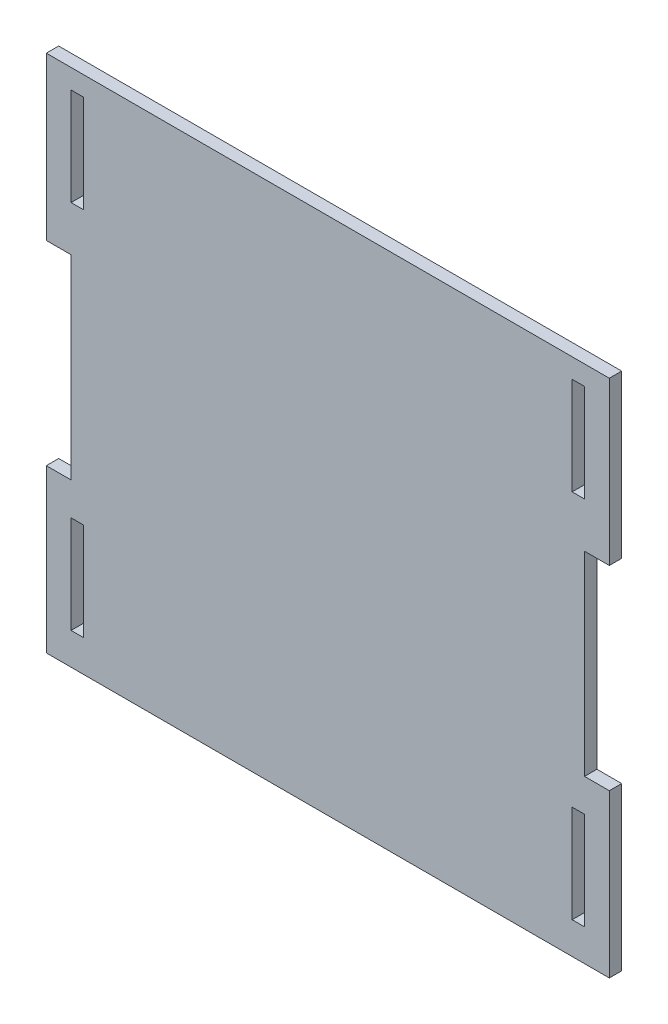
ISO-10303-21;
HEADER;
FILE_DESCRIPTION(('STEP AP214'),'2;1');
FILE_NAME('part.step','',(''),(''),'','','');
FILE_SCHEMA(('AUTOMOTIVE_DESIGN { 1 0 10303 214 1 1 1 1 }'));
ENDSEC;
DATA;
#1=APPLICATION_CONTEXT('core data for automotive mechanical design processes');
#2=APPLICATION_PROTOCOL_DEFINITION('international standard','automotive_design',2000,#1);
#3=PRODUCT_CONTEXT('',#1,'mechanical');
#4=PRODUCT('Part','Part','',(#3));
#5=PRODUCT_RELATED_PRODUCT_CATEGORY('part','',(#4));
#6=PRODUCT_DEFINITION_FORMATION('','',#4);
#7=PRODUCT_DEFINITION_CONTEXT('part definition',#1,'design');
#8=PRODUCT_DEFINITION('design','',#6,#7);
#9=PRODUCT_DEFINITION_SHAPE('','',#8);
#10=(LENGTH_UNIT() NAMED_UNIT(*) SI_UNIT(.MILLI.,.METRE.));
#11=(NAMED_UNIT(*) PLANE_ANGLE_UNIT() SI_UNIT($,.RADIAN.));
#12=(NAMED_UNIT(*) SI_UNIT($,.STERADIAN.) SOLID_ANGLE_UNIT());
#13=UNCERTAINTY_MEASURE_WITH_UNIT(LENGTH_MEASURE(1.E-05),#10,'distance_accuracy_value','');
#14=(GEOMETRIC_REPRESENTATION_CONTEXT(3) GLOBAL_UNCERTAINTY_ASSIGNED_CONTEXT((#13)) GLOBAL_UNIT_ASSIGNED_CONTEXT((#10,
#11,#12)) REPRESENTATION_CONTEXT('',''));
#15=CARTESIAN_POINT('',(0.,0.,0.));
#16=DIRECTION('',(0.,0.,1.));
#17=DIRECTION('',(1.,0.,0.));
#18=AXIS2_PLACEMENT_3D('',#15,#16,#17);
#19=CARTESIAN_POINT('',(0.,0.,3.175));
#20=DIRECTION('',(0.,0.,1.));
#21=DIRECTION('',(1.,0.,0.));
#22=AXIS2_PLACEMENT_3D('',#19,#20,#21);
#23=PLANE('',#22);
#24=DIRECTION('',(0.,-1.,0.));
#25=VECTOR('',#24,1.);
#26=CARTESIAN_POINT('',(0.,0.,3.175));
#27=LINE('',#26,#25);
#28=CARTESIAN_POINT('',(0.,41.5875,3.175));
#29=VERTEX_POINT('',#28);
#30=CARTESIAN_POINT('',(0.,0.,3.175));
#31=VERTEX_POINT('',#30);
#32=EDGE_CURVE('E347',#29,#31,#27,.T.);
#33=ORIENTED_EDGE('',*,*,#32,.T.);
#34=DIRECTION('',(1.,0.,0.));
#35=VECTOR('',#34,1.);
#36=CARTESIAN_POINT('',(0.,0.,3.175));
#37=LINE('',#36,#35);
#38=CARTESIAN_POINT('',(144.35,0.,3.175));
#39=VERTEX_POINT('',#38);
#40=EDGE_CURVE('E350',#31,#39,#37,.T.);
#41=ORIENTED_EDGE('',*,*,#40,.T.);
#42=DIRECTION('',(0.,1.,0.));
#43=VECTOR('',#42,1.);
#44=CARTESIAN_POINT('',(144.35,0.,3.175));
#45=LINE('',#44,#43);
#46=CARTESIAN_POINT('',(144.35,41.5875,3.175));
#47=VERTEX_POINT('',#46);
#48=EDGE_CURVE('E353',#39,#47,#45,.T.);
#49=ORIENTED_EDGE('',*,*,#48,.T.);
#50=DIRECTION('',(-1.,0.,0.));
#51=VECTOR('',#50,1.);
#52=CARTESIAN_POINT('',(138.,41.5875,3.175));
#53=LINE('',#52,#51);
#54=CARTESIAN_POINT('',(138.,41.5875,3.175));
#55=VERTEX_POINT('',#54);
#56=EDGE_CURVE('E355',#47,#55,#53,.T.);
#57=ORIENTED_EDGE('',*,*,#56,.T.);
#58=DIRECTION('',(0.,1.,0.));
#59=VECTOR('',#58,1.);
#60=CARTESIAN_POINT('',(138.,91.5875,3.175));
#61=LINE('',#60,#59);
#62=CARTESIAN_POINT('',(138.,91.5875,3.175));
#63=VERTEX_POINT('',#62);
#64=EDGE_CURVE('E357',#55,#63,#61,.T.);
#65=ORIENTED_EDGE('',*,*,#64,.T.);
#66=DIRECTION('',(1.,0.,0.));
#67=VECTOR('',#66,1.);
#68=CARTESIAN_POINT('',(144.35,91.5875,3.175));
#69=LINE('',#68,#67);
#70=CARTESIAN_POINT('',(144.35,91.5875,3.175));
#71=VERTEX_POINT('',#70);
#72=EDGE_CURVE('E359',#63,#71,#69,.T.);
#73=ORIENTED_EDGE('',*,*,#72,.T.);
#74=DIRECTION('',(0.,1.,0.));
#75=VECTOR('',#74,1.);
#76=CARTESIAN_POINT('',(144.35,91.5875,3.175));
#77=LINE('',#76,#75);
#78=CARTESIAN_POINT('',(144.35,133.175,3.175));
#79=VERTEX_POINT('',#78);
#80=EDGE_CURVE('E361',#71,#79,#77,.T.);
#81=ORIENTED_EDGE('',*,*,#80,.T.);
#82=DIRECTION('',(-1.,0.,0.));
#83=VECTOR('',#82,1.);
#84=CARTESIAN_POINT('',(0.,133.175,3.175));
#85=LINE('',#84,#83);
#86=CARTESIAN_POINT('',(0.,133.175,3.175));
#87=VERTEX_POINT('',#86);
#88=EDGE_CURVE('E363',#79,#87,#85,.T.);
#89=ORIENTED_EDGE('',*,*,#88,.T.);
#90=DIRECTION('',(0.,-1.,0.));
#91=VECTOR('',#90,1.);
#92=CARTESIAN_POINT('',(0.,91.5875,3.175));
#93=LINE('',#92,#91);
#94=CARTESIAN_POINT('',(0.,91.5875,3.175));
#95=VERTEX_POINT('',#94);
#96=EDGE_CURVE('E365',#87,#95,#93,.T.);
#97=ORIENTED_EDGE('',*,*,#96,.T.);
#98=DIRECTION('',(1.,0.,0.));
#99=VECTOR('',#98,1.);
#100=CARTESIAN_POINT('',(0.,91.5875,3.175));
#101=LINE('',#100,#99);
#102=CARTESIAN_POINT('',(6.35,91.5875,3.175));
#103=VERTEX_POINT('',#102);
#104=EDGE_CURVE('E367',#95,#103,#101,.T.);
#105=ORIENTED_EDGE('',*,*,#104,.T.);
#106=DIRECTION('',(0.,-1.,0.));
#107=VECTOR('',#106,1.);
#108=CARTESIAN_POINT('',(6.35,91.5875,3.175));
#109=LINE('',#108,#107);
#110=CARTESIAN_POINT('',(6.35,41.5875,3.175));
#111=VERTEX_POINT('',#110);
#112=EDGE_CURVE('E369',#103,#111,#109,.T.);
#113=ORIENTED_EDGE('',*,*,#112,.T.);
#114=DIRECTION('',(-1.,0.,0.));
#115=VECTOR('',#114,1.);
#116=CARTESIAN_POINT('',(6.35,41.5875,3.175));
#117=LINE('',#116,#115);
#118=EDGE_CURVE('E371',#111,#29,#117,.T.);
#119=ORIENTED_EDGE('',*,*,#118,.T.);
#120=EDGE_LOOP('',(#33,#41,#49,#57,#65,#73,#81,#89,#97,#105,#113,#119));
#121=FACE_BOUND('',#120,.T.);
#122=DIRECTION('',(1.,0.,0.));
#123=VECTOR('',#122,1.);
#124=CARTESIAN_POINT('',(6.35,103.175,3.175));
#125=LINE('',#124,#123);
#126=CARTESIAN_POINT('',(6.35,103.175,3.175));
#127=VERTEX_POINT('',#126);
#128=CARTESIAN_POINT('',(9.525,103.175,3.175));
#129=VERTEX_POINT('',#128);
#130=EDGE_CURVE('E318',#127,#129,#125,.T.);
#131=ORIENTED_EDGE('',*,*,#130,.F.);
#132=DIRECTION('',(0.,-1.,0.));
#133=VECTOR('',#132,1.);
#134=CARTESIAN_POINT('',(6.35,103.175,3.175));
#135=LINE('',#134,#133);
#136=CARTESIAN_POINT('',(6.35,128.175,3.175));
#137=VERTEX_POINT('',#136);
#138=EDGE_CURVE('E316',#137,#127,#135,.T.);
#139=ORIENTED_EDGE('',*,*,#138,.F.);
#140=DIRECTION('',(-1.,0.,0.));
#141=VECTOR('',#140,1.);
#142=CARTESIAN_POINT('',(6.35,128.175,3.175));
#143=LINE('',#142,#141);
#144=CARTESIAN_POINT('',(9.525,128.175,3.175));
#145=VERTEX_POINT('',#144);
#146=EDGE_CURVE('E324',#145,#137,#143,.T.);
#147=ORIENTED_EDGE('',*,*,#146,.F.);
#148=DIRECTION('',(0.,1.,0.));
#149=VECTOR('',#148,1.);
#150=CARTESIAN_POINT('',(9.525,103.175,3.175));
#151=LINE('',#150,#149);
#152=EDGE_CURVE('E321',#129,#145,#151,.T.);
#153=ORIENTED_EDGE('',*,*,#152,.F.);
#154=EDGE_LOOP('',(#131,#139,#147,#153));
#155=FACE_BOUND('',#154,.T.);
#156=DIRECTION('',(-1.,0.,0.));
#157=VECTOR('',#156,1.);
#158=CARTESIAN_POINT('',(138.,128.175,3.175));
#159=LINE('',#158,#157);
#160=CARTESIAN_POINT('',(138.,128.175,3.175));
#161=VERTEX_POINT('',#160);
#162=CARTESIAN_POINT('',(134.825,128.175,3.175));
#163=VERTEX_POINT('',#162);
#164=EDGE_CURVE('E287',#161,#163,#159,.T.);
#165=ORIENTED_EDGE('',*,*,#164,.F.);
#166=DIRECTION('',(0.,1.,0.));
#167=VECTOR('',#166,1.);
#168=CARTESIAN_POINT('',(138.,103.175,3.175));
#169=LINE('',#168,#167);
#170=CARTESIAN_POINT('',(138.,103.175,3.175));
#171=VERTEX_POINT('',#170);
#172=EDGE_CURVE('E285',#171,#161,#169,.T.);
#173=ORIENTED_EDGE('',*,*,#172,.F.);
#174=DIRECTION('',(1.,0.,0.));
#175=VECTOR('',#174,1.);
#176=CARTESIAN_POINT('',(138.,103.175,3.175));
#177=LINE('',#176,#175);
#178=CARTESIAN_POINT('',(134.825,103.175,3.175));
#179=VERTEX_POINT('',#178);
#180=EDGE_CURVE('E293',#179,#171,#177,.T.);
#181=ORIENTED_EDGE('',*,*,#180,.F.);
#182=DIRECTION('',(0.,-1.,0.));
#183=VECTOR('',#182,1.);
#184=CARTESIAN_POINT('',(134.825,103.175,3.175));
#185=LINE('',#184,#183);
#186=EDGE_CURVE('E290',#163,#179,#185,.T.);
#187=ORIENTED_EDGE('',*,*,#186,.F.);
#188=EDGE_LOOP('',(#165,#173,#181,#187));
#189=FACE_BOUND('',#188,.T.);
#190=DIRECTION('',(1.,0.,0.));
#191=VECTOR('',#190,1.);
#192=CARTESIAN_POINT('',(6.35,8.175,3.175));
#193=LINE('',#192,#191);
#194=CARTESIAN_POINT('',(6.35,8.175,3.175));
#195=VERTEX_POINT('',#194);
#196=CARTESIAN_POINT('',(9.525,8.175,3.175));
#197=VERTEX_POINT('',#196);
#198=EDGE_CURVE('E256',#195,#197,#193,.T.);
#199=ORIENTED_EDGE('',*,*,#198,.F.);
#200=DIRECTION('',(0.,-1.,0.));
#201=VECTOR('',#200,1.);
#202=CARTESIAN_POINT('',(6.35,33.175,3.175));
#203=LINE('',#202,#201);
#204=CARTESIAN_POINT('',(6.35,33.175,3.175));
#205=VERTEX_POINT('',#204);
#206=EDGE_CURVE('E254',#205,#195,#203,.T.);
#207=ORIENTED_EDGE('',*,*,#206,.F.);
#208=DIRECTION('',(-1.,0.,0.));
#209=VECTOR('',#208,1.);
#210=CARTESIAN_POINT('',(6.35,33.175,3.175));
#211=LINE('',#210,#209);
#212=CARTESIAN_POINT('',(9.525,33.175,3.175));
#213=VERTEX_POINT('',#212);
#214=EDGE_CURVE('E262',#213,#205,#211,.T.);
#215=ORIENTED_EDGE('',*,*,#214,.F.);
#216=DIRECTION('',(0.,1.,0.));
#217=VECTOR('',#216,1.);
#218=CARTESIAN_POINT('',(9.525,33.175,3.175));
#219=LINE('',#218,#217);
#220=EDGE_CURVE('E259',#197,#213,#219,.T.);
#221=ORIENTED_EDGE('',*,*,#220,.F.);
#222=EDGE_LOOP('',(#199,#207,#215,#221));
#223=FACE_BOUND('',#222,.T.);
#224=DIRECTION('',(-1.,0.,0.));
#225=VECTOR('',#224,1.);
#226=CARTESIAN_POINT('',(138.,33.175,3.175));
#227=LINE('',#226,#225);
#228=CARTESIAN_POINT('',(138.,33.175,3.175));
#229=VERTEX_POINT('',#228);
#230=CARTESIAN_POINT('',(134.825,33.175,3.175));
#231=VERTEX_POINT('',#230);
#232=EDGE_CURVE('E226',#229,#231,#227,.T.);
#233=ORIENTED_EDGE('',*,*,#232,.F.);
#234=DIRECTION('',(0.,1.,0.));
#235=VECTOR('',#234,1.);
#236=CARTESIAN_POINT('',(138.,33.175,3.175));
#237=LINE('',#236,#235);
#238=CARTESIAN_POINT('',(138.,8.175,3.175));
#239=VERTEX_POINT('',#238);
#240=EDGE_CURVE('E218',#239,#229,#237,.T.);
#241=ORIENTED_EDGE('',*,*,#240,.F.);
#242=DIRECTION('',(1.,0.,0.));
#243=VECTOR('',#242,1.);
#244=CARTESIAN_POINT('',(138.,8.175,3.175));
#245=LINE('',#244,#243);
#246=CARTESIAN_POINT('',(134.825,8.175,3.175));
#247=VERTEX_POINT('',#246);
#248=EDGE_CURVE('E240',#247,#239,#245,.T.);
#249=ORIENTED_EDGE('',*,*,#248,.F.);
#250=DIRECTION('',(0.,-1.,0.));
#251=VECTOR('',#250,1.);
#252=CARTESIAN_POINT('',(134.825,33.175,3.175));
#253=LINE('',#252,#251);
#254=EDGE_CURVE('E238',#231,#247,#253,.T.);
#255=ORIENTED_EDGE('',*,*,#254,.F.);
#256=EDGE_LOOP('',(#233,#241,#249,#255));
#257=FACE_BOUND('',#256,.T.);
#258=ADVANCED_FACE('F33',(#121,#155,#189,#223,#257),#23,.T.);
#259=CARTESIAN_POINT('',(0.,0.,0.));
#260=DIRECTION('',(0.,0.,1.));
#261=DIRECTION('',(1.,0.,0.));
#262=AXIS2_PLACEMENT_3D('',#259,#260,#261);
#263=PLANE('',#262);
#264=DIRECTION('',(0.,-1.,0.));
#265=VECTOR('',#264,1.);
#266=CARTESIAN_POINT('',(6.35,33.175,0.));
#267=LINE('',#266,#265);
#268=CARTESIAN_POINT('',(6.35,33.175,0.));
#269=VERTEX_POINT('',#268);
#270=CARTESIAN_POINT('',(6.35,8.175,0.));
#271=VERTEX_POINT('',#270);
#272=EDGE_CURVE('E234',#269,#271,#267,.T.);
#273=ORIENTED_EDGE('',*,*,#272,.T.);
#274=DIRECTION('',(1.,0.,0.));
#275=VECTOR('',#274,1.);
#276=CARTESIAN_POINT('',(6.35,8.175,0.));
#277=LINE('',#276,#275);
#278=CARTESIAN_POINT('',(9.525,8.175,0.));
#279=VERTEX_POINT('',#278);
#280=EDGE_CURVE('E267',#271,#279,#277,.T.);
#281=ORIENTED_EDGE('',*,*,#280,.T.);
#282=DIRECTION('',(0.,1.,0.));
#283=VECTOR('',#282,1.);
#284=CARTESIAN_POINT('',(9.525,33.175,0.));
#285=LINE('',#284,#283);
#286=CARTESIAN_POINT('',(9.525,33.175,0.));
#287=VERTEX_POINT('',#286);
#288=EDGE_CURVE('E270',#279,#287,#285,.T.);
#289=ORIENTED_EDGE('',*,*,#288,.T.);
#290=DIRECTION('',(-1.,0.,0.));
#291=VECTOR('',#290,1.);
#292=CARTESIAN_POINT('',(6.35,33.175,0.));
#293=LINE('',#292,#291);
#294=EDGE_CURVE('E257',#287,#269,#293,.T.);
#295=ORIENTED_EDGE('',*,*,#294,.T.);
#296=EDGE_LOOP('',(#273,#281,#289,#295));
#297=FACE_BOUND('',#296,.T.);
#298=DIRECTION('',(0.,-1.,0.));
#299=VECTOR('',#298,1.);
#300=CARTESIAN_POINT('',(6.35,103.175,0.));
#301=LINE('',#300,#299);
#302=CARTESIAN_POINT('',(6.35,128.175,0.));
#303=VERTEX_POINT('',#302);
#304=CARTESIAN_POINT('',(6.35,103.175,0.));
#305=VERTEX_POINT('',#304);
#306=EDGE_CURVE('E315',#303,#305,#301,.T.);
#307=ORIENTED_EDGE('',*,*,#306,.T.);
#308=DIRECTION('',(1.,0.,0.));
#309=VECTOR('',#308,1.);
#310=CARTESIAN_POINT('',(6.35,103.175,0.));
#311=LINE('',#310,#309);
#312=CARTESIAN_POINT('',(9.525,103.175,0.));
#313=VERTEX_POINT('',#312);
#314=EDGE_CURVE('E329',#305,#313,#311,.T.);
#315=ORIENTED_EDGE('',*,*,#314,.T.);
#316=DIRECTION('',(0.,1.,0.));
#317=VECTOR('',#316,1.);
#318=CARTESIAN_POINT('',(9.525,103.175,0.));
#319=LINE('',#318,#317);
#320=CARTESIAN_POINT('',(9.525,128.175,0.));
#321=VERTEX_POINT('',#320);
#322=EDGE_CURVE('E332',#313,#321,#319,.T.);
#323=ORIENTED_EDGE('',*,*,#322,.T.);
#324=DIRECTION('',(-1.,0.,0.));
#325=VECTOR('',#324,1.);
#326=CARTESIAN_POINT('',(6.35,128.175,0.));
#327=LINE('',#326,#325);
#328=EDGE_CURVE('E319',#321,#303,#327,.T.);
#329=ORIENTED_EDGE('',*,*,#328,.T.);
#330=EDGE_LOOP('',(#307,#315,#323,#329));
#331=FACE_BOUND('',#330,.T.);
#332=DIRECTION('',(0.,-1.,0.));
#333=VECTOR('',#332,1.);
#334=CARTESIAN_POINT('',(0.,0.,0.));
#335=LINE('',#334,#333);
#336=CARTESIAN_POINT('',(0.,41.5875,0.));
#337=VERTEX_POINT('',#336);
#338=CARTESIAN_POINT('',(0.,0.,0.));
#339=VERTEX_POINT('',#338);
#340=EDGE_CURVE('E346',#337,#339,#335,.T.);
#341=ORIENTED_EDGE('',*,*,#340,.F.);
#342=DIRECTION('',(-1.,0.,0.));
#343=VECTOR('',#342,1.);
#344=CARTESIAN_POINT('',(6.35,41.5875,0.));
#345=LINE('',#344,#343);
#346=CARTESIAN_POINT('',(6.35,41.5875,0.));
#347=VERTEX_POINT('',#346);
#348=EDGE_CURVE('E351',#347,#337,#345,.T.);
#349=ORIENTED_EDGE('',*,*,#348,.F.);
#350=DIRECTION('',(0.,-1.,0.));
#351=VECTOR('',#350,1.);
#352=CARTESIAN_POINT('',(6.35,91.5875,0.));
#353=LINE('',#352,#351);
#354=CARTESIAN_POINT('',(6.35,91.5875,0.));
#355=VERTEX_POINT('',#354);
#356=EDGE_CURVE('E394',#355,#347,#353,.T.);
#357=ORIENTED_EDGE('',*,*,#356,.F.);
#358=DIRECTION('',(1.,0.,0.));
#359=VECTOR('',#358,1.);
#360=CARTESIAN_POINT('',(0.,91.5875,0.));
#361=LINE('',#360,#359);
#362=CARTESIAN_POINT('',(0.,91.5875,0.));
#363=VERTEX_POINT('',#362);
#364=EDGE_CURVE('E392',#363,#355,#361,.T.);
#365=ORIENTED_EDGE('',*,*,#364,.F.);
#366=DIRECTION('',(0.,-1.,0.));
#367=VECTOR('',#366,1.);
#368=CARTESIAN_POINT('',(0.,91.5875,0.));
#369=LINE('',#368,#367);
#370=CARTESIAN_POINT('',(0.,133.175,0.));
#371=VERTEX_POINT('',#370);
#372=EDGE_CURVE('E390',#371,#363,#369,.T.);
#373=ORIENTED_EDGE('',*,*,#372,.F.);
#374=DIRECTION('',(-1.,0.,0.));
#375=VECTOR('',#374,1.);
#376=CARTESIAN_POINT('',(0.,133.175,0.));
#377=LINE('',#376,#375);
#378=CARTESIAN_POINT('',(144.35,133.175,0.));
#379=VERTEX_POINT('',#378);
#380=EDGE_CURVE('E388',#379,#371,#377,.T.);
#381=ORIENTED_EDGE('',*,*,#380,.F.);
#382=DIRECTION('',(0.,1.,0.));
#383=VECTOR('',#382,1.);
#384=CARTESIAN_POINT('',(144.35,91.5875,0.));
#385=LINE('',#384,#383);
#386=CARTESIAN_POINT('',(144.35,91.5875,0.));
#387=VERTEX_POINT('',#386);
#388=EDGE_CURVE('E386',#387,#379,#385,.T.);
#389=ORIENTED_EDGE('',*,*,#388,.F.);
#390=DIRECTION('',(1.,0.,0.));
#391=VECTOR('',#390,1.);
#392=CARTESIAN_POINT('',(144.35,91.5875,0.));
#393=LINE('',#392,#391);
#394=CARTESIAN_POINT('',(138.,91.5875,0.));
#395=VERTEX_POINT('',#394);
#396=EDGE_CURVE('E384',#395,#387,#393,.T.);
#397=ORIENTED_EDGE('',*,*,#396,.F.);
#398=DIRECTION('',(0.,1.,0.));
#399=VECTOR('',#398,1.);
#400=CARTESIAN_POINT('',(138.,91.5875,0.));
#401=LINE('',#400,#399);
#402=CARTESIAN_POINT('',(138.,41.5875,0.));
#403=VERTEX_POINT('',#402);
#404=EDGE_CURVE('E382',#403,#395,#401,.T.);
#405=ORIENTED_EDGE('',*,*,#404,.F.);
#406=DIRECTION('',(-1.,0.,0.));
#407=VECTOR('',#406,1.);
#408=CARTESIAN_POINT('',(138.,41.5875,0.));
#409=LINE('',#408,#407);
#410=CARTESIAN_POINT('',(144.35,41.5875,0.));
#411=VERTEX_POINT('',#410);
#412=EDGE_CURVE('E380',#411,#403,#409,.T.);
#413=ORIENTED_EDGE('',*,*,#412,.F.);
#414=DIRECTION('',(0.,1.,0.));
#415=VECTOR('',#414,1.);
#416=CARTESIAN_POINT('',(144.35,0.,0.));
#417=LINE('',#416,#415);
#418=CARTESIAN_POINT('',(144.35,0.,0.));
#419=VERTEX_POINT('',#418);
#420=EDGE_CURVE('E378',#419,#411,#417,.T.);
#421=ORIENTED_EDGE('',*,*,#420,.F.);
#422=DIRECTION('',(1.,0.,0.));
#423=VECTOR('',#422,1.);
#424=CARTESIAN_POINT('',(0.,0.,0.));
#425=LINE('',#424,#423);
#426=EDGE_CURVE('E376',#339,#419,#425,.T.);
#427=ORIENTED_EDGE('',*,*,#426,.F.);
#428=EDGE_LOOP('',(#341,#349,#357,#365,#373,#381,#389,#397,#405,#413,#421,#427));
#429=FACE_BOUND('',#428,.T.);
#430=DIRECTION('',(0.,1.,0.));
#431=VECTOR('',#430,1.);
#432=CARTESIAN_POINT('',(138.,103.175,0.));
#433=LINE('',#432,#431);
#434=CARTESIAN_POINT('',(138.,103.175,0.));
#435=VERTEX_POINT('',#434);
#436=CARTESIAN_POINT('',(138.,128.175,0.));
#437=VERTEX_POINT('',#436);
#438=EDGE_CURVE('E284',#435,#437,#433,.T.);
#439=ORIENTED_EDGE('',*,*,#438,.T.);
#440=DIRECTION('',(-1.,0.,0.));
#441=VECTOR('',#440,1.);
#442=CARTESIAN_POINT('',(138.,128.175,0.));
#443=LINE('',#442,#441);
#444=CARTESIAN_POINT('',(134.825,128.175,0.));
#445=VERTEX_POINT('',#444);
#446=EDGE_CURVE('E298',#437,#445,#443,.T.);
#447=ORIENTED_EDGE('',*,*,#446,.T.);
#448=DIRECTION('',(0.,-1.,0.));
#449=VECTOR('',#448,1.);
#450=CARTESIAN_POINT('',(134.825,103.175,0.));
#451=LINE('',#450,#449);
#452=CARTESIAN_POINT('',(134.825,103.175,0.));
#453=VERTEX_POINT('',#452);
#454=EDGE_CURVE('E301',#445,#453,#451,.T.);
#455=ORIENTED_EDGE('',*,*,#454,.T.);
#456=DIRECTION('',(1.,0.,0.));
#457=VECTOR('',#456,1.);
#458=CARTESIAN_POINT('',(138.,103.175,0.));
#459=LINE('',#458,#457);
#460=EDGE_CURVE('E288',#453,#435,#459,.T.);
#461=ORIENTED_EDGE('',*,*,#460,.T.);
#462=EDGE_LOOP('',(#439,#447,#455,#461));
#463=FACE_BOUND('',#462,.T.);
#464=DIRECTION('',(0.,1.,0.));
#465=VECTOR('',#464,1.);
#466=CARTESIAN_POINT('',(138.,33.175,0.));
#467=LINE('',#466,#465);
#468=CARTESIAN_POINT('',(138.,8.175,0.));
#469=VERTEX_POINT('',#468);
#470=CARTESIAN_POINT('',(138.,33.175,0.));
#471=VERTEX_POINT('',#470);
#472=EDGE_CURVE('E56',#469,#471,#467,.T.);
#473=ORIENTED_EDGE('',*,*,#472,.T.);
#474=DIRECTION('',(-1.,0.,0.));
#475=VECTOR('',#474,1.);
#476=CARTESIAN_POINT('',(138.,33.175,0.));
#477=LINE('',#476,#475);
#478=CARTESIAN_POINT('',(134.825,33.175,0.));
#479=VERTEX_POINT('',#478);
#480=EDGE_CURVE('E233',#471,#479,#477,.T.);
#481=ORIENTED_EDGE('',*,*,#480,.T.);
#482=DIRECTION('',(0.,-1.,0.));
#483=VECTOR('',#482,1.);
#484=CARTESIAN_POINT('',(134.825,33.175,0.));
#485=LINE('',#484,#483);
#486=CARTESIAN_POINT('',(134.825,8.175,0.));
#487=VERTEX_POINT('',#486);
#488=EDGE_CURVE('E246',#479,#487,#485,.T.);
#489=ORIENTED_EDGE('',*,*,#488,.T.);
#490=DIRECTION('',(1.,0.,0.));
#491=VECTOR('',#490,1.);
#492=CARTESIAN_POINT('',(138.,8.175,0.));
#493=LINE('',#492,#491);
#494=EDGE_CURVE('E227',#487,#469,#493,.T.);
#495=ORIENTED_EDGE('',*,*,#494,.T.);
#496=EDGE_LOOP('',(#473,#481,#489,#495));
#497=FACE_BOUND('',#496,.T.);
#498=ADVANCED_FACE('F436',(#297,#331,#429,#463,#497),#263,.F.);
#499=CARTESIAN_POINT('',(0.,0.,3.175));
#500=DIRECTION('',(1.,0.,0.));
#501=DIRECTION('',(0.,0.,-1.));
#502=AXIS2_PLACEMENT_3D('',#499,#500,#501);
#503=PLANE('',#502);
#504=ORIENTED_EDGE('',*,*,#340,.T.);
#505=DIRECTION('',(0.,0.,-1.));
#506=VECTOR('',#505,1.);
#507=CARTESIAN_POINT('',(0.,0.,3.175));
#508=LINE('',#507,#506);
#509=EDGE_CURVE('E11',#31,#339,#508,.T.);
#510=ORIENTED_EDGE('',*,*,#509,.F.);
#511=ORIENTED_EDGE('',*,*,#32,.F.);
#512=DIRECTION('',(0.,0.,-1.));
#513=VECTOR('',#512,1.);
#514=CARTESIAN_POINT('',(0.,41.5875,3.175));
#515=LINE('',#514,#513);
#516=EDGE_CURVE('E373',#29,#337,#515,.T.);
#517=ORIENTED_EDGE('',*,*,#516,.T.);
#518=EDGE_LOOP('',(#504,#510,#511,#517));
#519=FACE_BOUND('',#518,.T.);
#520=ADVANCED_FACE('F35',(#519),#503,.F.);
#521=CARTESIAN_POINT('',(0.,0.,3.175));
#522=DIRECTION('',(0.,1.,0.));
#523=DIRECTION('',(0.,0.,1.));
#524=AXIS2_PLACEMENT_3D('',#521,#522,#523);
#525=PLANE('',#524);
#526=ORIENTED_EDGE('',*,*,#426,.T.);
#527=DIRECTION('',(0.,0.,-1.));
#528=VECTOR('',#527,1.);
#529=CARTESIAN_POINT('',(144.35,0.,3.175));
#530=LINE('',#529,#528);
#531=EDGE_CURVE('E41',#39,#419,#530,.T.);
#532=ORIENTED_EDGE('',*,*,#531,.F.);
#533=ORIENTED_EDGE('',*,*,#40,.F.);
#534=ORIENTED_EDGE('',*,*,#509,.T.);
#535=EDGE_LOOP('',(#526,#532,#533,#534));
#536=FACE_BOUND('',#535,.T.);
#537=ADVANCED_FACE('F454',(#536),#525,.F.);
#538=CARTESIAN_POINT('',(144.35,0.,3.175));
#539=DIRECTION('',(-1.,0.,0.));
#540=DIRECTION('',(0.,0.,1.));
#541=AXIS2_PLACEMENT_3D('',#538,#539,#540);
#542=PLANE('',#541);
#543=ORIENTED_EDGE('',*,*,#420,.T.);
#544=DIRECTION('',(0.,0.,-1.));
#545=VECTOR('',#544,1.);
#546=CARTESIAN_POINT('',(144.35,41.5875,3.175));
#547=LINE('',#546,#545);
#548=EDGE_CURVE('E423',#47,#411,#547,.T.);
#549=ORIENTED_EDGE('',*,*,#548,.F.);
#550=ORIENTED_EDGE('',*,*,#48,.F.);
#551=ORIENTED_EDGE('',*,*,#531,.T.);
#552=EDGE_LOOP('',(#543,#549,#550,#551));
#553=FACE_BOUND('',#552,.T.);
#554=ADVANCED_FACE('F430',(#553),#542,.F.);
#555=CARTESIAN_POINT('',(138.,41.5875,3.175));
#556=DIRECTION('',(0.,-1.,0.));
#557=DIRECTION('',(0.,0.,-1.));
#558=AXIS2_PLACEMENT_3D('',#555,#556,#557);
#559=PLANE('',#558);
#560=ORIENTED_EDGE('',*,*,#412,.T.);
#561=DIRECTION('',(0.,0.,-1.));
#562=VECTOR('',#561,1.);
#563=CARTESIAN_POINT('',(138.,41.5875,3.175));
#564=LINE('',#563,#562);
#565=EDGE_CURVE('E420',#55,#403,#564,.T.);
#566=ORIENTED_EDGE('',*,*,#565,.F.);
#567=ORIENTED_EDGE('',*,*,#56,.F.);
#568=ORIENTED_EDGE('',*,*,#548,.T.);
#569=EDGE_LOOP('',(#560,#566,#567,#568));
#570=FACE_BOUND('',#569,.T.);
#571=ADVANCED_FACE('F442',(#570),#559,.F.);
#572=CARTESIAN_POINT('',(138.,91.5875,3.175));
#573=DIRECTION('',(-1.,0.,0.));
#574=DIRECTION('',(0.,0.,1.));
#575=AXIS2_PLACEMENT_3D('',#572,#573,#574);
#576=PLANE('',#575);
#577=ORIENTED_EDGE('',*,*,#404,.T.);
#578=DIRECTION('',(0.,0.,-1.));
#579=VECTOR('',#578,1.);
#580=CARTESIAN_POINT('',(138.,91.5875,3.175));
#581=LINE('',#580,#579);
#582=EDGE_CURVE('E417',#63,#395,#581,.T.);
#583=ORIENTED_EDGE('',*,*,#582,.F.);
#584=ORIENTED_EDGE('',*,*,#64,.F.);
#585=ORIENTED_EDGE('',*,*,#565,.T.);
#586=EDGE_LOOP('',(#577,#583,#584,#585));
#587=FACE_BOUND('',#586,.T.);
#588=ADVANCED_FACE('F446',(#587),#576,.F.);
#589=CARTESIAN_POINT('',(144.35,91.5875,3.175));
#590=DIRECTION('',(0.,1.,0.));
#591=DIRECTION('',(0.,0.,1.));
#592=AXIS2_PLACEMENT_3D('',#589,#590,#591);
#593=PLANE('',#592);
#594=ORIENTED_EDGE('',*,*,#396,.T.);
#595=DIRECTION('',(0.,0.,-1.));
#596=VECTOR('',#595,1.);
#597=CARTESIAN_POINT('',(144.35,91.5875,3.175));
#598=LINE('',#597,#596);
#599=EDGE_CURVE('E414',#71,#387,#598,.T.);
#600=ORIENTED_EDGE('',*,*,#599,.F.);
#601=ORIENTED_EDGE('',*,*,#72,.F.);
#602=ORIENTED_EDGE('',*,*,#582,.T.);
#603=EDGE_LOOP('',(#594,#600,#601,#602));
#604=FACE_BOUND('',#603,.T.);
#605=ADVANCED_FACE('F487',(#604),#593,.F.);
#606=CARTESIAN_POINT('',(144.35,91.5875,3.175));
#607=DIRECTION('',(-1.,0.,0.));
#608=DIRECTION('',(0.,0.,1.));
#609=AXIS2_PLACEMENT_3D('',#606,#607,#608);
#610=PLANE('',#609);
#611=ORIENTED_EDGE('',*,*,#388,.T.);
#612=DIRECTION('',(0.,0.,-1.));
#613=VECTOR('',#612,1.);
#614=CARTESIAN_POINT('',(144.35,133.175,3.175));
#615=LINE('',#614,#613);
#616=EDGE_CURVE('E411',#79,#379,#615,.T.);
#617=ORIENTED_EDGE('',*,*,#616,.F.);
#618=ORIENTED_EDGE('',*,*,#80,.F.);
#619=ORIENTED_EDGE('',*,*,#599,.T.);
#620=EDGE_LOOP('',(#611,#617,#618,#619));
#621=FACE_BOUND('',#620,.T.);
#622=ADVANCED_FACE('F485',(#621),#610,.F.);
#623=CARTESIAN_POINT('',(0.,133.175,3.175));
#624=DIRECTION('',(0.,-1.,0.));
#625=DIRECTION('',(1.,0.,0.));
#626=AXIS2_PLACEMENT_3D('',#623,#624,#625);
#627=PLANE('',#626);
#628=ORIENTED_EDGE('',*,*,#380,.T.);
#629=DIRECTION('',(0.,0.,-1.));
#630=VECTOR('',#629,1.);
#631=CARTESIAN_POINT('',(0.,133.175,3.175));
#632=LINE('',#631,#630);
#633=EDGE_CURVE('E408',#87,#371,#632,.T.);
#634=ORIENTED_EDGE('',*,*,#633,.F.);
#635=ORIENTED_EDGE('',*,*,#88,.F.);
#636=ORIENTED_EDGE('',*,*,#616,.T.);
#637=EDGE_LOOP('',(#628,#634,#635,#636));
#638=FACE_BOUND('',#637,.T.);
#639=ADVANCED_FACE('F481',(#638),#627,.F.);
#640=CARTESIAN_POINT('',(0.,91.5875,3.175));
#641=DIRECTION('',(1.,0.,0.));
#642=DIRECTION('',(0.,0.,-1.));
#643=AXIS2_PLACEMENT_3D('',#640,#641,#642);
#644=PLANE('',#643);
#645=ORIENTED_EDGE('',*,*,#372,.T.);
#646=DIRECTION('',(0.,0.,-1.));
#647=VECTOR('',#646,1.);
#648=CARTESIAN_POINT('',(0.,91.5875,3.175));
#649=LINE('',#648,#647);
#650=EDGE_CURVE('E405',#95,#363,#649,.T.);
#651=ORIENTED_EDGE('',*,*,#650,.F.);
#652=ORIENTED_EDGE('',*,*,#96,.F.);
#653=ORIENTED_EDGE('',*,*,#633,.T.);
#654=EDGE_LOOP('',(#645,#651,#652,#653));
#655=FACE_BOUND('',#654,.T.);
#656=ADVANCED_FACE('F476',(#655),#644,.F.);
#657=CARTESIAN_POINT('',(0.,91.5875,3.175));
#658=DIRECTION('',(0.,1.,0.));
#659=DIRECTION('',(0.,0.,1.));
#660=AXIS2_PLACEMENT_3D('',#657,#658,#659);
#661=PLANE('',#660);
#662=ORIENTED_EDGE('',*,*,#364,.T.);
#663=DIRECTION('',(0.,0.,-1.));
#664=VECTOR('',#663,1.);
#665=CARTESIAN_POINT('',(6.35,91.5875,3.175));
#666=LINE('',#665,#664);
#667=EDGE_CURVE('E402',#103,#355,#666,.T.);
#668=ORIENTED_EDGE('',*,*,#667,.F.);
#669=ORIENTED_EDGE('',*,*,#104,.F.);
#670=ORIENTED_EDGE('',*,*,#650,.T.);
#671=EDGE_LOOP('',(#662,#668,#669,#670));
#672=FACE_BOUND('',#671,.T.);
#673=ADVANCED_FACE('F470',(#672),#661,.F.);
#674=CARTESIAN_POINT('',(6.35,91.5875,3.175));
#675=DIRECTION('',(1.,0.,0.));
#676=DIRECTION('',(0.,0.,-1.));
#677=AXIS2_PLACEMENT_3D('',#674,#675,#676);
#678=PLANE('',#677);
#679=ORIENTED_EDGE('',*,*,#356,.T.);
#680=DIRECTION('',(0.,0.,-1.));
#681=VECTOR('',#680,1.);
#682=CARTESIAN_POINT('',(6.35,41.5875,3.175));
#683=LINE('',#682,#681);
#684=EDGE_CURVE('E399',#111,#347,#683,.T.);
#685=ORIENTED_EDGE('',*,*,#684,.F.);
#686=ORIENTED_EDGE('',*,*,#112,.F.);
#687=ORIENTED_EDGE('',*,*,#667,.T.);
#688=EDGE_LOOP('',(#679,#685,#686,#687));
#689=FACE_BOUND('',#688,.T.);
#690=ADVANCED_FACE('F466',(#689),#678,.F.);
#691=CARTESIAN_POINT('',(6.35,41.5875,3.175));
#692=DIRECTION('',(0.,-1.,0.));
#693=DIRECTION('',(0.,0.,-1.));
#694=AXIS2_PLACEMENT_3D('',#691,#692,#693);
#695=PLANE('',#694);
#696=ORIENTED_EDGE('',*,*,#348,.T.);
#697=ORIENTED_EDGE('',*,*,#516,.F.);
#698=ORIENTED_EDGE('',*,*,#118,.F.);
#699=ORIENTED_EDGE('',*,*,#684,.T.);
#700=EDGE_LOOP('',(#696,#697,#698,#699));
#701=FACE_BOUND('',#700,.T.);
#702=ADVANCED_FACE('F461',(#701),#695,.F.);
#703=CARTESIAN_POINT('',(6.35,103.175,3.175));
#704=DIRECTION('',(1.,0.,0.));
#705=DIRECTION('',(0.,0.,-1.));
#706=AXIS2_PLACEMENT_3D('',#703,#704,#705);
#707=PLANE('',#706);
#708=ORIENTED_EDGE('',*,*,#306,.F.);
#709=DIRECTION('',(0.,0.,-1.));
#710=VECTOR('',#709,1.);
#711=CARTESIAN_POINT('',(6.35,128.175,3.175));
#712=LINE('',#711,#710);
#713=EDGE_CURVE('E326',#137,#303,#712,.T.);
#714=ORIENTED_EDGE('',*,*,#713,.F.);
#715=ORIENTED_EDGE('',*,*,#138,.T.);
#716=DIRECTION('',(0.,0.,-1.));
#717=VECTOR('',#716,1.);
#718=CARTESIAN_POINT('',(6.35,103.175,3.175));
#719=LINE('',#718,#717);
#720=EDGE_CURVE('E343',#127,#305,#719,.T.);
#721=ORIENTED_EDGE('',*,*,#720,.T.);
#722=EDGE_LOOP('',(#708,#714,#715,#721));
#723=FACE_BOUND('',#722,.T.);
#724=ADVANCED_FACE('F504',(#723),#707,.T.);
#725=CARTESIAN_POINT('',(6.35,103.175,3.175));
#726=DIRECTION('',(0.,1.,0.));
#727=DIRECTION('',(0.,0.,1.));
#728=AXIS2_PLACEMENT_3D('',#725,#726,#727);
#729=PLANE('',#728);
#730=ORIENTED_EDGE('',*,*,#314,.F.);
#731=ORIENTED_EDGE('',*,*,#720,.F.);
#732=ORIENTED_EDGE('',*,*,#130,.T.);
#733=DIRECTION('',(0.,0.,-1.));
#734=VECTOR('',#733,1.);
#735=CARTESIAN_POINT('',(9.525,103.175,3.175));
#736=LINE('',#735,#734);
#737=EDGE_CURVE('E341',#129,#313,#736,.T.);
#738=ORIENTED_EDGE('',*,*,#737,.T.);
#739=EDGE_LOOP('',(#730,#731,#732,#738));
#740=FACE_BOUND('',#739,.T.);
#741=ADVANCED_FACE('F542',(#740),#729,.T.);
#742=CARTESIAN_POINT('',(9.525,103.175,3.175));
#743=DIRECTION('',(-1.,0.,0.));
#744=DIRECTION('',(0.,0.,1.));
#745=AXIS2_PLACEMENT_3D('',#742,#743,#744);
#746=PLANE('',#745);
#747=ORIENTED_EDGE('',*,*,#322,.F.);
#748=ORIENTED_EDGE('',*,*,#737,.F.);
#749=ORIENTED_EDGE('',*,*,#152,.T.);
#750=DIRECTION('',(0.,0.,-1.));
#751=VECTOR('',#750,1.);
#752=CARTESIAN_POINT('',(9.525,128.175,3.175));
#753=LINE('',#752,#751);
#754=EDGE_CURVE('E339',#145,#321,#753,.T.);
#755=ORIENTED_EDGE('',*,*,#754,.T.);
#756=EDGE_LOOP('',(#747,#748,#749,#755));
#757=FACE_BOUND('',#756,.T.);
#758=ADVANCED_FACE('F549',(#757),#746,.T.);
#759=CARTESIAN_POINT('',(6.35,128.175,3.175));
#760=DIRECTION('',(0.,-1.,0.));
#761=DIRECTION('',(0.,0.,-1.));
#762=AXIS2_PLACEMENT_3D('',#759,#760,#761);
#763=PLANE('',#762);
#764=ORIENTED_EDGE('',*,*,#328,.F.);
#765=ORIENTED_EDGE('',*,*,#754,.F.);
#766=ORIENTED_EDGE('',*,*,#146,.T.);
#767=ORIENTED_EDGE('',*,*,#713,.T.);
#768=EDGE_LOOP('',(#764,#765,#766,#767));
#769=FACE_BOUND('',#768,.T.);
#770=ADVANCED_FACE('F556',(#769),#763,.T.);
#771=CARTESIAN_POINT('',(138.,103.175,3.175));
#772=DIRECTION('',(-1.,0.,0.));
#773=DIRECTION('',(0.,0.,1.));
#774=AXIS2_PLACEMENT_3D('',#771,#772,#773);
#775=PLANE('',#774);
#776=ORIENTED_EDGE('',*,*,#438,.F.);
#777=DIRECTION('',(0.,0.,-1.));
#778=VECTOR('',#777,1.);
#779=CARTESIAN_POINT('',(138.,103.175,3.175));
#780=LINE('',#779,#778);
#781=EDGE_CURVE('E295',#171,#435,#780,.T.);
#782=ORIENTED_EDGE('',*,*,#781,.F.);
#783=ORIENTED_EDGE('',*,*,#172,.T.);
#784=DIRECTION('',(0.,0.,-1.));
#785=VECTOR('',#784,1.);
#786=CARTESIAN_POINT('',(138.,128.175,3.175));
#787=LINE('',#786,#785);
#788=EDGE_CURVE('E312',#161,#437,#787,.T.);
#789=ORIENTED_EDGE('',*,*,#788,.T.);
#790=EDGE_LOOP('',(#776,#782,#783,#789));
#791=FACE_BOUND('',#790,.T.);
#792=ADVANCED_FACE('F564',(#791),#775,.T.);
#793=CARTESIAN_POINT('',(138.,128.175,3.175));
#794=DIRECTION('',(0.,-1.,0.));
#795=DIRECTION('',(0.,0.,-1.));
#796=AXIS2_PLACEMENT_3D('',#793,#794,#795);
#797=PLANE('',#796);
#798=ORIENTED_EDGE('',*,*,#446,.F.);
#799=ORIENTED_EDGE('',*,*,#788,.F.);
#800=ORIENTED_EDGE('',*,*,#164,.T.);
#801=DIRECTION('',(0.,0.,-1.));
#802=VECTOR('',#801,1.);
#803=CARTESIAN_POINT('',(134.825,128.175,3.175));
#804=LINE('',#803,#802);
#805=EDGE_CURVE('E310',#163,#445,#804,.T.);
#806=ORIENTED_EDGE('',*,*,#805,.T.);
#807=EDGE_LOOP('',(#798,#799,#800,#806));
#808=FACE_BOUND('',#807,.T.);
#809=ADVANCED_FACE('F572',(#808),#797,.T.);
#810=CARTESIAN_POINT('',(134.825,103.175,3.175));
#811=DIRECTION('',(1.,0.,0.));
#812=DIRECTION('',(0.,1.,0.));
#813=AXIS2_PLACEMENT_3D('',#810,#811,#812);
#814=PLANE('',#813);
#815=ORIENTED_EDGE('',*,*,#454,.F.);
#816=ORIENTED_EDGE('',*,*,#805,.F.);
#817=ORIENTED_EDGE('',*,*,#186,.T.);
#818=DIRECTION('',(0.,0.,-1.));
#819=VECTOR('',#818,1.);
#820=CARTESIAN_POINT('',(134.825,103.175,3.175));
#821=LINE('',#820,#819);
#822=EDGE_CURVE('E308',#179,#453,#821,.T.);
#823=ORIENTED_EDGE('',*,*,#822,.T.);
#824=EDGE_LOOP('',(#815,#816,#817,#823));
#825=FACE_BOUND('',#824,.T.);
#826=ADVANCED_FACE('F580',(#825),#814,.T.);
#827=CARTESIAN_POINT('',(138.,103.175,3.175));
#828=DIRECTION('',(0.,1.,0.));
#829=DIRECTION('',(0.,0.,1.));
#830=AXIS2_PLACEMENT_3D('',#827,#828,#829);
#831=PLANE('',#830);
#832=ORIENTED_EDGE('',*,*,#460,.F.);
#833=ORIENTED_EDGE('',*,*,#822,.F.);
#834=ORIENTED_EDGE('',*,*,#180,.T.);
#835=ORIENTED_EDGE('',*,*,#781,.T.);
#836=EDGE_LOOP('',(#832,#833,#834,#835));
#837=FACE_BOUND('',#836,.T.);
#838=ADVANCED_FACE('F588',(#837),#831,.T.);
#839=CARTESIAN_POINT('',(6.35,33.175,3.175));
#840=DIRECTION('',(1.,0.,0.));
#841=DIRECTION('',(0.,1.,0.));
#842=AXIS2_PLACEMENT_3D('',#839,#840,#841);
#843=PLANE('',#842);
#844=ORIENTED_EDGE('',*,*,#272,.F.);
#845=DIRECTION('',(0.,0.,-1.));
#846=VECTOR('',#845,1.);
#847=CARTESIAN_POINT('',(6.35,33.175,3.175));
#848=LINE('',#847,#846);
#849=EDGE_CURVE('E264',#205,#269,#848,.T.);
#850=ORIENTED_EDGE('',*,*,#849,.F.);
#851=ORIENTED_EDGE('',*,*,#206,.T.);
#852=DIRECTION('',(0.,0.,-1.));
#853=VECTOR('',#852,1.);
#854=CARTESIAN_POINT('',(6.35,8.175,3.175));
#855=LINE('',#854,#853);
#856=EDGE_CURVE('E281',#195,#271,#855,.T.);
#857=ORIENTED_EDGE('',*,*,#856,.T.);
#858=EDGE_LOOP('',(#844,#850,#851,#857));
#859=FACE_BOUND('',#858,.T.);
#860=ADVANCED_FACE('F596',(#859),#843,.T.);
#861=CARTESIAN_POINT('',(6.35,8.175,3.175));
#862=DIRECTION('',(0.,1.,0.));
#863=DIRECTION('',(0.,0.,1.));
#864=AXIS2_PLACEMENT_3D('',#861,#862,#863);
#865=PLANE('',#864);
#866=ORIENTED_EDGE('',*,*,#280,.F.);
#867=ORIENTED_EDGE('',*,*,#856,.F.);
#868=ORIENTED_EDGE('',*,*,#198,.T.);
#869=DIRECTION('',(0.,0.,-1.));
#870=VECTOR('',#869,1.);
#871=CARTESIAN_POINT('',(9.525,8.175,3.175));
#872=LINE('',#871,#870);
#873=EDGE_CURVE('E279',#197,#279,#872,.T.);
#874=ORIENTED_EDGE('',*,*,#873,.T.);
#875=EDGE_LOOP('',(#866,#867,#868,#874));
#876=FACE_BOUND('',#875,.T.);
#877=ADVANCED_FACE('F604',(#876),#865,.T.);
#878=CARTESIAN_POINT('',(9.525,33.175,3.175));
#879=DIRECTION('',(-1.,0.,0.));
#880=DIRECTION('',(0.,-1.,0.));
#881=AXIS2_PLACEMENT_3D('',#878,#879,#880);
#882=PLANE('',#881);
#883=ORIENTED_EDGE('',*,*,#288,.F.);
#884=ORIENTED_EDGE('',*,*,#873,.F.);
#885=ORIENTED_EDGE('',*,*,#220,.T.);
#886=DIRECTION('',(0.,0.,-1.));
#887=VECTOR('',#886,1.);
#888=CARTESIAN_POINT('',(9.525,33.175,3.175));
#889=LINE('',#888,#887);
#890=EDGE_CURVE('E277',#213,#287,#889,.T.);
#891=ORIENTED_EDGE('',*,*,#890,.T.);
#892=EDGE_LOOP('',(#883,#884,#885,#891));
#893=FACE_BOUND('',#892,.T.);
#894=ADVANCED_FACE('F612',(#893),#882,.T.);
#895=CARTESIAN_POINT('',(6.35,33.175,3.175));
#896=DIRECTION('',(0.,-1.,0.));
#897=DIRECTION('',(0.,0.,-1.));
#898=AXIS2_PLACEMENT_3D('',#895,#896,#897);
#899=PLANE('',#898);
#900=ORIENTED_EDGE('',*,*,#294,.F.);
#901=ORIENTED_EDGE('',*,*,#890,.F.);
#902=ORIENTED_EDGE('',*,*,#214,.T.);
#903=ORIENTED_EDGE('',*,*,#849,.T.);
#904=EDGE_LOOP('',(#900,#901,#902,#903));
#905=FACE_BOUND('',#904,.T.);
#906=ADVANCED_FACE('F620',(#905),#899,.T.);
#907=CARTESIAN_POINT('',(138.,33.175,3.175));
#908=DIRECTION('',(-1.,0.,0.));
#909=DIRECTION('',(0.,0.,1.));
#910=AXIS2_PLACEMENT_3D('',#907,#908,#909);
#911=PLANE('',#910);
#912=ORIENTED_EDGE('',*,*,#472,.F.);
#913=DIRECTION('',(0.,0.,-1.));
#914=VECTOR('',#913,1.);
#915=CARTESIAN_POINT('',(138.,8.175,3.175));
#916=LINE('',#915,#914);
#917=EDGE_CURVE('E222',#239,#469,#916,.T.);
#918=ORIENTED_EDGE('',*,*,#917,.F.);
#919=ORIENTED_EDGE('',*,*,#240,.T.);
#920=DIRECTION('',(0.,0.,-1.));
#921=VECTOR('',#920,1.);
#922=CARTESIAN_POINT('',(138.,33.175,3.175));
#923=LINE('',#922,#921);
#924=EDGE_CURVE('E221',#229,#471,#923,.T.);
#925=ORIENTED_EDGE('',*,*,#924,.T.);
#926=EDGE_LOOP('',(#912,#918,#919,#925));
#927=FACE_BOUND('',#926,.T.);
#928=ADVANCED_FACE('F220',(#927),#911,.T.);
#929=CARTESIAN_POINT('',(138.,33.175,3.175));
#930=DIRECTION('',(0.,-1.,0.));
#931=DIRECTION('',(0.,0.,-1.));
#932=AXIS2_PLACEMENT_3D('',#929,#930,#931);
#933=PLANE('',#932);
#934=ORIENTED_EDGE('',*,*,#480,.F.);
#935=ORIENTED_EDGE('',*,*,#924,.F.);
#936=ORIENTED_EDGE('',*,*,#232,.T.);
#937=DIRECTION('',(0.,0.,-1.));
#938=VECTOR('',#937,1.);
#939=CARTESIAN_POINT('',(134.825,33.175,3.175));
#940=LINE('',#939,#938);
#941=EDGE_CURVE('E235',#231,#479,#940,.T.);
#942=ORIENTED_EDGE('',*,*,#941,.T.);
#943=EDGE_LOOP('',(#934,#935,#936,#942));
#944=FACE_BOUND('',#943,.T.);
#945=ADVANCED_FACE('F230',(#944),#933,.T.);
#946=CARTESIAN_POINT('',(134.825,33.175,3.175));
#947=DIRECTION('',(1.,0.,0.));
#948=DIRECTION('',(0.,1.,0.));
#949=AXIS2_PLACEMENT_3D('',#946,#947,#948);
#950=PLANE('',#949);
#951=ORIENTED_EDGE('',*,*,#488,.F.);
#952=ORIENTED_EDGE('',*,*,#941,.F.);
#953=ORIENTED_EDGE('',*,*,#254,.T.);
#954=DIRECTION('',(0.,0.,-1.));
#955=VECTOR('',#954,1.);
#956=CARTESIAN_POINT('',(134.825,8.175,3.175));
#957=LINE('',#956,#955);
#958=EDGE_CURVE('E48',#247,#487,#957,.T.);
#959=ORIENTED_EDGE('',*,*,#958,.T.);
#960=EDGE_LOOP('',(#951,#952,#953,#959));
#961=FACE_BOUND('',#960,.T.);
#962=ADVANCED_FACE('F641',(#961),#950,.T.);
#963=CARTESIAN_POINT('',(138.,8.175,3.175));
#964=DIRECTION('',(0.,1.,0.));
#965=DIRECTION('',(-1.,0.,0.));
#966=AXIS2_PLACEMENT_3D('',#963,#964,#965);
#967=PLANE('',#966);
#968=ORIENTED_EDGE('',*,*,#494,.F.);
#969=ORIENTED_EDGE('',*,*,#958,.F.);
#970=ORIENTED_EDGE('',*,*,#248,.T.);
#971=ORIENTED_EDGE('',*,*,#917,.T.);
#972=EDGE_LOOP('',(#968,#969,#970,#971));
#973=FACE_BOUND('',#972,.T.);
#974=ADVANCED_FACE('F648',(#973),#967,.T.);
#975=CLOSED_SHELL('',(#258,#498,#520,#537,#554,#571,#588,#605,#622,#639,#656,#673,#690,#702,
#724,#741,#758,#770,#792,#809,#826,#838,#860,#877,#894,#906,#928,#945,#962,#974));
#976=MANIFOLD_SOLID_BREP('B2',#975);
#977=ADVANCED_BREP_SHAPE_REPRESENTATION('',(#18,#976),#14);
#978=SHAPE_DEFINITION_REPRESENTATION(#9,#977);
ENDSEC;
END-ISO-10303-21;
